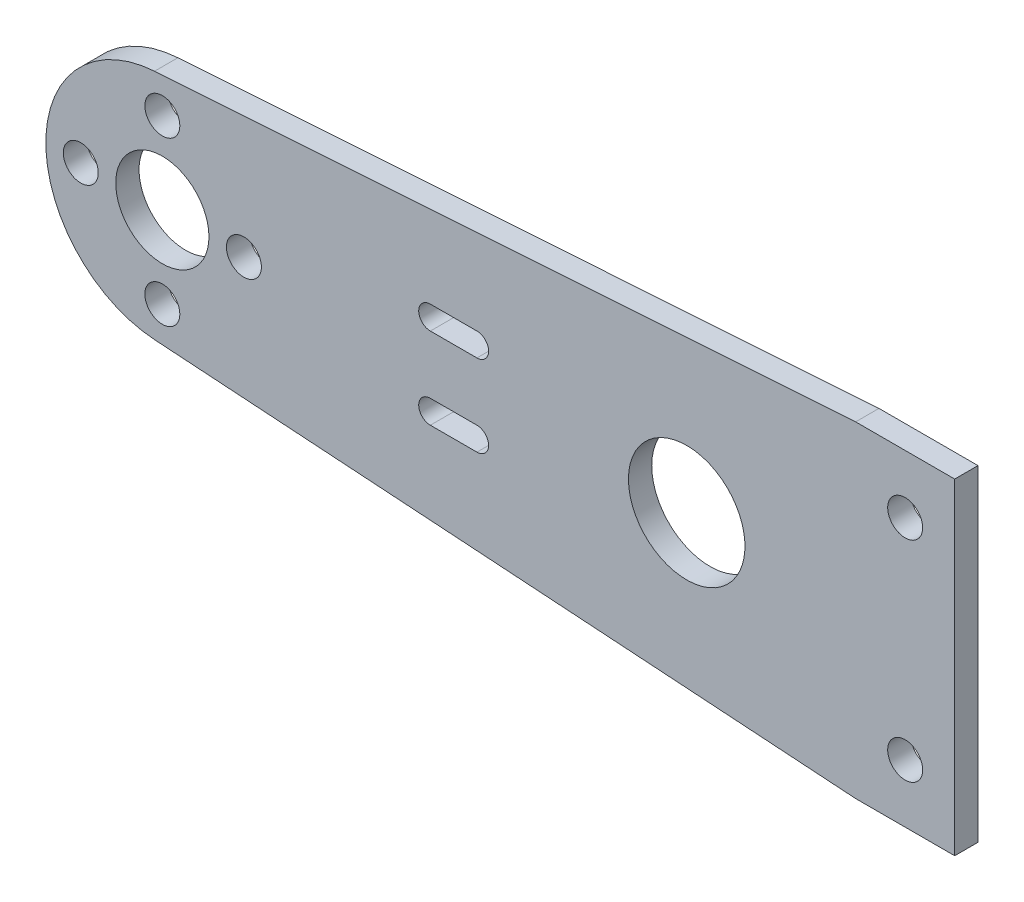
ISO-10303-21;
HEADER;
FILE_DESCRIPTION(('STEP AP214'),'2;1');
FILE_NAME('part.step','',(''),(''),'','','');
FILE_SCHEMA(('AUTOMOTIVE_DESIGN { 1 0 10303 214 1 1 1 1 }'));
ENDSEC;
DATA;
#1=APPLICATION_CONTEXT('core data for automotive mechanical design processes');
#2=APPLICATION_PROTOCOL_DEFINITION('international standard','automotive_design',2000,#1);
#3=PRODUCT_CONTEXT('',#1,'mechanical');
#4=PRODUCT('Part','Part','',(#3));
#5=PRODUCT_RELATED_PRODUCT_CATEGORY('part','',(#4));
#6=PRODUCT_DEFINITION_FORMATION('','',#4);
#7=PRODUCT_DEFINITION_CONTEXT('part definition',#1,'design');
#8=PRODUCT_DEFINITION('design','',#6,#7);
#9=PRODUCT_DEFINITION_SHAPE('','',#8);
#10=(LENGTH_UNIT() NAMED_UNIT(*) SI_UNIT(.MILLI.,.METRE.));
#11=(NAMED_UNIT(*) PLANE_ANGLE_UNIT() SI_UNIT($,.RADIAN.));
#12=(NAMED_UNIT(*) SI_UNIT($,.STERADIAN.) SOLID_ANGLE_UNIT());
#13=UNCERTAINTY_MEASURE_WITH_UNIT(LENGTH_MEASURE(1.E-05),#10,'distance_accuracy_value','');
#14=(GEOMETRIC_REPRESENTATION_CONTEXT(3) GLOBAL_UNCERTAINTY_ASSIGNED_CONTEXT((#13)) GLOBAL_UNIT_ASSIGNED_CONTEXT((#10,
#11,#12)) REPRESENTATION_CONTEXT('',''));
#15=CARTESIAN_POINT('',(0.,0.,0.));
#16=DIRECTION('',(0.,0.,1.));
#17=DIRECTION('',(1.,0.,0.));
#18=AXIS2_PLACEMENT_3D('',#15,#16,#17);
#19=CARTESIAN_POINT('',(0.,0.,2.));
#20=DIRECTION('',(0.,0.,1.));
#21=DIRECTION('',(1.,0.,0.));
#22=AXIS2_PLACEMENT_3D('',#19,#20,#21);
#23=PLANE('',#22);
#24=CARTESIAN_POINT('',(27.,3.5,2.));
#25=DIRECTION('',(0.,0.,-1.));
#26=DIRECTION('',(1.,0.,0.));
#27=AXIS2_PLACEMENT_3D('',#24,#25,#26);
#28=CIRCLE('',#27,0.999999999999994);
#29=CARTESIAN_POINT('',(27.,4.49999999999999,2.));
#30=VERTEX_POINT('',#29);
#31=CARTESIAN_POINT('',(27.,2.50000000000001,2.));
#32=VERTEX_POINT('',#31);
#33=EDGE_CURVE('E141',#30,#32,#28,.T.);
#34=ORIENTED_EDGE('',*,*,#33,.T.);
#35=DIRECTION('',(-1.,0.,0.));
#36=VECTOR('',#35,1.);
#37=CARTESIAN_POINT('',(27.,2.50000000000001,2.));
#38=LINE('',#37,#36);
#39=CARTESIAN_POINT('',(23.,2.50000000000001,2.));
#40=VERTEX_POINT('',#39);
#41=EDGE_CURVE('E152',#32,#40,#38,.T.);
#42=ORIENTED_EDGE('',*,*,#41,.T.);
#43=CARTESIAN_POINT('',(23.,3.5,2.));
#44=DIRECTION('',(0.,0.,-1.));
#45=DIRECTION('',(1.,0.,0.));
#46=AXIS2_PLACEMENT_3D('',#43,#44,#45);
#47=CIRCLE('',#46,0.999999999999994);
#48=CARTESIAN_POINT('',(23.,4.49999999999999,2.));
#49=VERTEX_POINT('',#48);
#50=EDGE_CURVE('E51',#40,#49,#47,.T.);
#51=ORIENTED_EDGE('',*,*,#50,.T.);
#52=DIRECTION('',(1.,0.,0.));
#53=VECTOR('',#52,1.);
#54=CARTESIAN_POINT('',(27.,4.49999999999999,2.));
#55=LINE('',#54,#53);
#56=EDGE_CURVE('E149',#49,#30,#55,.T.);
#57=ORIENTED_EDGE('',*,*,#56,.T.);
#58=EDGE_LOOP('',(#34,#42,#51,#57));
#59=FACE_BOUND('',#58,.T.);
#60=CARTESIAN_POINT('',(45.,0.,2.));
#61=DIRECTION('',(0.,0.,-1.));
#62=DIRECTION('',(-1.,0.,0.));
#63=AXIS2_PLACEMENT_3D('',#60,#61,#62);
#64=CIRCLE('',#63,5.);
#65=CARTESIAN_POINT('',(40.,0.,2.));
#66=VERTEX_POINT('',#65);
#67=EDGE_CURVE('E194',#66,#66,#64,.T.);
#68=ORIENTED_EDGE('',*,*,#67,.T.);
#69=EDGE_LOOP('',(#68));
#70=FACE_BOUND('',#69,.T.);
#71=CARTESIAN_POINT('',(27.,-3.5,2.));
#72=DIRECTION('',(0.,0.,-1.));
#73=DIRECTION('',(-1.,0.,0.));
#74=AXIS2_PLACEMENT_3D('',#71,#72,#73);
#75=CIRCLE('',#74,0.999999999999994);
#76=CARTESIAN_POINT('',(27.,-2.50000000000001,2.));
#77=VERTEX_POINT('',#76);
#78=CARTESIAN_POINT('',(27.,-4.5,2.));
#79=VERTEX_POINT('',#78);
#80=EDGE_CURVE('E179',#77,#79,#75,.T.);
#81=ORIENTED_EDGE('',*,*,#80,.T.);
#82=DIRECTION('',(-1.,0.,0.));
#83=VECTOR('',#82,1.);
#84=CARTESIAN_POINT('',(27.,-4.5,2.));
#85=LINE('',#84,#83);
#86=CARTESIAN_POINT('',(23.,-4.5,2.));
#87=VERTEX_POINT('',#86);
#88=EDGE_CURVE('E182',#79,#87,#85,.T.);
#89=ORIENTED_EDGE('',*,*,#88,.T.);
#90=CARTESIAN_POINT('',(23.,-3.5,2.));
#91=DIRECTION('',(0.,0.,-1.));
#92=DIRECTION('',(-1.,0.,0.));
#93=AXIS2_PLACEMENT_3D('',#90,#91,#92);
#94=CIRCLE('',#93,0.999999999999993);
#95=CARTESIAN_POINT('',(23.,-2.50000000000001,2.));
#96=VERTEX_POINT('',#95);
#97=EDGE_CURVE('E59',#87,#96,#94,.T.);
#98=ORIENTED_EDGE('',*,*,#97,.T.);
#99=DIRECTION('',(1.,0.,0.));
#100=VECTOR('',#99,1.);
#101=CARTESIAN_POINT('',(27.,-2.50000000000001,2.));
#102=LINE('',#101,#100);
#103=EDGE_CURVE('E187',#96,#77,#102,.T.);
#104=ORIENTED_EDGE('',*,*,#103,.T.);
#105=EDGE_LOOP('',(#81,#89,#98,#104));
#106=FACE_BOUND('',#105,.T.);
#107=CARTESIAN_POINT('',(0.,7.,2.));
#108=DIRECTION('',(0.,0.,1.));
#109=DIRECTION('',(1.,0.,0.));
#110=AXIS2_PLACEMENT_3D('',#107,#108,#109);
#111=CIRCLE('',#110,1.50000000000001);
#112=CARTESIAN_POINT('',(1.50000000000001,7.,2.));
#113=VERTEX_POINT('',#112);
#114=EDGE_CURVE('E217',#113,#113,#111,.T.);
#115=ORIENTED_EDGE('',*,*,#114,.F.);
#116=EDGE_LOOP('',(#115));
#117=FACE_BOUND('',#116,.T.);
#118=CARTESIAN_POINT('',(0.,-7.,2.));
#119=DIRECTION('',(0.,0.,1.));
#120=DIRECTION('',(1.,0.,0.));
#121=AXIS2_PLACEMENT_3D('',#118,#119,#120);
#122=CIRCLE('',#121,1.5);
#123=CARTESIAN_POINT('',(1.5,-7.,2.));
#124=VERTEX_POINT('',#123);
#125=EDGE_CURVE('E229',#124,#124,#122,.T.);
#126=ORIENTED_EDGE('',*,*,#125,.F.);
#127=EDGE_LOOP('',(#126));
#128=FACE_BOUND('',#127,.T.);
#129=CARTESIAN_POINT('',(0.,0.,2.));
#130=DIRECTION('',(0.,0.,1.));
#131=DIRECTION('',(1.,0.,0.));
#132=AXIS2_PLACEMENT_3D('',#129,#130,#131);
#133=CIRCLE('',#132,4.00000000000001);
#134=CARTESIAN_POINT('',(4.00000000000001,0.,2.));
#135=VERTEX_POINT('',#134);
#136=EDGE_CURVE('E241',#135,#135,#133,.T.);
#137=ORIENTED_EDGE('',*,*,#136,.F.);
#138=EDGE_LOOP('',(#137));
#139=FACE_BOUND('',#138,.T.);
#140=CARTESIAN_POINT('',(0.,0.,2.));
#141=DIRECTION('',(0.,0.,1.));
#142=DIRECTION('',(1.,0.,0.));
#143=AXIS2_PLACEMENT_3D('',#140,#141,#142);
#144=CIRCLE('',#143,10.);
#145=CARTESIAN_POINT('',(-0.667028634575726,9.977728839804,2.));
#146=VERTEX_POINT('',#145);
#147=CARTESIAN_POINT('',(-0.667028634575722,-9.97772883980402,2.));
#148=VERTEX_POINT('',#147);
#149=EDGE_CURVE('E253',#146,#148,#144,.T.);
#150=ORIENTED_EDGE('',*,*,#149,.T.);
#151=DIRECTION('',(0.997772883980398,-0.0667028634575719,0.));
#152=VECTOR('',#151,1.);
#153=CARTESIAN_POINT('',(-0.667028634575722,-9.97772883980402,2.));
#154=LINE('',#153,#152);
#155=CARTESIAN_POINT('',(59.5,-14.,2.));
#156=VERTEX_POINT('',#155);
#157=EDGE_CURVE('E256',#148,#156,#154,.T.);
#158=ORIENTED_EDGE('',*,*,#157,.T.);
#159=DIRECTION('',(1.,0.,0.));
#160=VECTOR('',#159,1.);
#161=CARTESIAN_POINT('',(59.5,-14.,2.));
#162=LINE('',#161,#160);
#163=CARTESIAN_POINT('',(68.,-14.,2.));
#164=VERTEX_POINT('',#163);
#165=EDGE_CURVE('E259',#156,#164,#162,.T.);
#166=ORIENTED_EDGE('',*,*,#165,.T.);
#167=DIRECTION('',(0.,1.,0.));
#168=VECTOR('',#167,1.);
#169=CARTESIAN_POINT('',(68.,-14.,2.));
#170=LINE('',#169,#168);
#171=CARTESIAN_POINT('',(68.,14.,2.));
#172=VERTEX_POINT('',#171);
#173=EDGE_CURVE('E261',#164,#172,#170,.T.);
#174=ORIENTED_EDGE('',*,*,#173,.T.);
#175=DIRECTION('',(-1.,0.,0.));
#176=VECTOR('',#175,1.);
#177=CARTESIAN_POINT('',(59.5,14.,2.));
#178=LINE('',#177,#176);
#179=CARTESIAN_POINT('',(59.5,14.,2.));
#180=VERTEX_POINT('',#179);
#181=EDGE_CURVE('E263',#172,#180,#178,.T.);
#182=ORIENTED_EDGE('',*,*,#181,.T.);
#183=DIRECTION('',(-0.997772883980398,-0.0667028634575723,0.));
#184=VECTOR('',#183,1.);
#185=CARTESIAN_POINT('',(-0.667028634575726,9.977728839804,2.));
#186=LINE('',#185,#184);
#187=EDGE_CURVE('E265',#180,#146,#186,.T.);
#188=ORIENTED_EDGE('',*,*,#187,.T.);
#189=EDGE_LOOP('',(#150,#158,#166,#174,#182,#188));
#190=FACE_BOUND('',#189,.T.);
#191=CARTESIAN_POINT('',(63.75,9.,2.));
#192=DIRECTION('',(0.,0.,1.));
#193=DIRECTION('',(1.,0.,0.));
#194=AXIS2_PLACEMENT_3D('',#191,#192,#193);
#195=CIRCLE('',#194,1.49999999999997);
#196=CARTESIAN_POINT('',(65.25,9.,2.));
#197=VERTEX_POINT('',#196);
#198=EDGE_CURVE('E247',#197,#197,#195,.T.);
#199=ORIENTED_EDGE('',*,*,#198,.F.);
#200=EDGE_LOOP('',(#199));
#201=FACE_BOUND('',#200,.T.);
#202=CARTESIAN_POINT('',(7.,0.,2.));
#203=DIRECTION('',(0.,0.,1.));
#204=DIRECTION('',(1.,0.,0.));
#205=AXIS2_PLACEMENT_3D('',#202,#203,#204);
#206=CIRCLE('',#205,1.5);
#207=CARTESIAN_POINT('',(8.5,0.,2.));
#208=VERTEX_POINT('',#207);
#209=EDGE_CURVE('E235',#208,#208,#206,.T.);
#210=ORIENTED_EDGE('',*,*,#209,.F.);
#211=EDGE_LOOP('',(#210));
#212=FACE_BOUND('',#211,.T.);
#213=CARTESIAN_POINT('',(-7.00000000000001,0.,2.));
#214=DIRECTION('',(0.,0.,1.));
#215=DIRECTION('',(1.,0.,0.));
#216=AXIS2_PLACEMENT_3D('',#213,#214,#215);
#217=CIRCLE('',#216,1.5);
#218=CARTESIAN_POINT('',(-5.50000000000001,0.,2.));
#219=VERTEX_POINT('',#218);
#220=EDGE_CURVE('E223',#219,#219,#217,.T.);
#221=ORIENTED_EDGE('',*,*,#220,.F.);
#222=EDGE_LOOP('',(#221));
#223=FACE_BOUND('',#222,.T.);
#224=CARTESIAN_POINT('',(63.75,-9.,2.));
#225=DIRECTION('',(0.,0.,1.));
#226=DIRECTION('',(1.,0.,0.));
#227=AXIS2_PLACEMENT_3D('',#224,#225,#226);
#228=CIRCLE('',#227,1.49999999999997);
#229=CARTESIAN_POINT('',(65.25,-9.,2.));
#230=VERTEX_POINT('',#229);
#231=EDGE_CURVE('E211',#230,#230,#228,.T.);
#232=ORIENTED_EDGE('',*,*,#231,.F.);
#233=EDGE_LOOP('',(#232));
#234=FACE_BOUND('',#233,.T.);
#235=ADVANCED_FACE('F36',(#59,#70,#106,#117,#128,#139,#190,#201,#212,#223,#234),#23,.T.);
#236=CARTESIAN_POINT('',(0.,0.,0.));
#237=DIRECTION('',(0.,0.,1.));
#238=DIRECTION('',(1.,0.,0.));
#239=AXIS2_PLACEMENT_3D('',#236,#237,#238);
#240=PLANE('',#239);
#241=DIRECTION('',(-1.,0.,0.));
#242=VECTOR('',#241,1.);
#243=CARTESIAN_POINT('',(27.,2.50000000000001,0.));
#244=LINE('',#243,#242);
#245=CARTESIAN_POINT('',(27.,2.50000000000001,0.));
#246=VERTEX_POINT('',#245);
#247=CARTESIAN_POINT('',(23.,2.50000000000001,0.));
#248=VERTEX_POINT('',#247);
#249=EDGE_CURVE('E170',#246,#248,#244,.T.);
#250=ORIENTED_EDGE('',*,*,#249,.F.);
#251=CARTESIAN_POINT('',(27.,3.5,0.));
#252=DIRECTION('',(0.,0.,-1.));
#253=DIRECTION('',(1.,0.,0.));
#254=AXIS2_PLACEMENT_3D('',#251,#252,#253);
#255=CIRCLE('',#254,0.999999999999994);
#256=CARTESIAN_POINT('',(27.,4.49999999999999,0.));
#257=VERTEX_POINT('',#256);
#258=EDGE_CURVE('E144',#257,#246,#255,.T.);
#259=ORIENTED_EDGE('',*,*,#258,.F.);
#260=DIRECTION('',(1.,0.,0.));
#261=VECTOR('',#260,1.);
#262=CARTESIAN_POINT('',(27.,4.49999999999999,0.));
#263=LINE('',#262,#261);
#264=CARTESIAN_POINT('',(23.,4.49999999999999,0.));
#265=VERTEX_POINT('',#264);
#266=EDGE_CURVE('E158',#265,#257,#263,.T.);
#267=ORIENTED_EDGE('',*,*,#266,.F.);
#268=CARTESIAN_POINT('',(23.,3.5,0.));
#269=DIRECTION('',(0.,0.,-1.));
#270=DIRECTION('',(1.,0.,0.));
#271=AXIS2_PLACEMENT_3D('',#268,#269,#270);
#272=CIRCLE('',#271,0.999999999999994);
#273=EDGE_CURVE('E161',#248,#265,#272,.T.);
#274=ORIENTED_EDGE('',*,*,#273,.F.);
#275=EDGE_LOOP('',(#250,#259,#267,#274));
#276=FACE_BOUND('',#275,.T.);
#277=CARTESIAN_POINT('',(45.,0.,0.));
#278=DIRECTION('',(0.,0.,-1.));
#279=DIRECTION('',(-1.,0.,0.));
#280=AXIS2_PLACEMENT_3D('',#277,#278,#279);
#281=CIRCLE('',#280,5.);
#282=CARTESIAN_POINT('',(40.,0.,0.));
#283=VERTEX_POINT('',#282);
#284=EDGE_CURVE('E164',#283,#283,#281,.T.);
#285=ORIENTED_EDGE('',*,*,#284,.F.);
#286=EDGE_LOOP('',(#285));
#287=FACE_BOUND('',#286,.T.);
#288=DIRECTION('',(-1.,0.,0.));
#289=VECTOR('',#288,1.);
#290=CARTESIAN_POINT('',(27.,-4.5,0.));
#291=LINE('',#290,#289);
#292=CARTESIAN_POINT('',(27.,-4.5,0.));
#293=VERTEX_POINT('',#292);
#294=CARTESIAN_POINT('',(23.,-4.49999999999999,0.));
#295=VERTEX_POINT('',#294);
#296=EDGE_CURVE('E193',#293,#295,#291,.T.);
#297=ORIENTED_EDGE('',*,*,#296,.F.);
#298=CARTESIAN_POINT('',(27.,-3.5,0.));
#299=DIRECTION('',(0.,0.,-1.));
#300=DIRECTION('',(-1.,0.,0.));
#301=AXIS2_PLACEMENT_3D('',#298,#299,#300);
#302=CIRCLE('',#301,0.999999999999994);
#303=CARTESIAN_POINT('',(27.,-2.50000000000001,0.));
#304=VERTEX_POINT('',#303);
#305=EDGE_CURVE('E191',#304,#293,#302,.T.);
#306=ORIENTED_EDGE('',*,*,#305,.F.);
#307=DIRECTION('',(1.,0.,0.));
#308=VECTOR('',#307,1.);
#309=CARTESIAN_POINT('',(27.,-2.50000000000001,0.));
#310=LINE('',#309,#308);
#311=CARTESIAN_POINT('',(23.,-2.50000000000001,0.));
#312=VERTEX_POINT('',#311);
#313=EDGE_CURVE('E183',#312,#304,#310,.T.);
#314=ORIENTED_EDGE('',*,*,#313,.F.);
#315=CARTESIAN_POINT('',(23.,-3.5,0.));
#316=DIRECTION('',(0.,0.,-1.));
#317=DIRECTION('',(-1.,0.,0.));
#318=AXIS2_PLACEMENT_3D('',#315,#316,#317);
#319=CIRCLE('',#318,0.999999999999993);
#320=EDGE_CURVE('E197',#295,#312,#319,.T.);
#321=ORIENTED_EDGE('',*,*,#320,.F.);
#322=EDGE_LOOP('',(#297,#306,#314,#321));
#323=FACE_BOUND('',#322,.T.);
#324=CARTESIAN_POINT('',(0.,0.,0.));
#325=DIRECTION('',(0.,0.,1.));
#326=DIRECTION('',(1.,0.,0.));
#327=AXIS2_PLACEMENT_3D('',#324,#325,#326);
#328=CIRCLE('',#327,10.);
#329=CARTESIAN_POINT('',(-0.667028634575726,9.977728839804,0.));
#330=VERTEX_POINT('',#329);
#331=CARTESIAN_POINT('',(-0.667028634575722,-9.97772883980402,0.));
#332=VERTEX_POINT('',#331);
#333=EDGE_CURVE('E250',#330,#332,#328,.T.);
#334=ORIENTED_EDGE('',*,*,#333,.F.);
#335=DIRECTION('',(-0.997772883980398,-0.0667028634575723,0.));
#336=VECTOR('',#335,1.);
#337=CARTESIAN_POINT('',(-0.667028634575726,9.977728839804,0.));
#338=LINE('',#337,#336);
#339=CARTESIAN_POINT('',(59.5,14.,0.));
#340=VERTEX_POINT('',#339);
#341=EDGE_CURVE('E257',#340,#330,#338,.T.);
#342=ORIENTED_EDGE('',*,*,#341,.F.);
#343=DIRECTION('',(-1.,0.,0.));
#344=VECTOR('',#343,1.);
#345=CARTESIAN_POINT('',(59.5,14.,0.));
#346=LINE('',#345,#344);
#347=CARTESIAN_POINT('',(68.,14.,0.));
#348=VERTEX_POINT('',#347);
#349=EDGE_CURVE('E276',#348,#340,#346,.T.);
#350=ORIENTED_EDGE('',*,*,#349,.F.);
#351=DIRECTION('',(0.,1.,0.));
#352=VECTOR('',#351,1.);
#353=CARTESIAN_POINT('',(68.,-14.,0.));
#354=LINE('',#353,#352);
#355=CARTESIAN_POINT('',(68.,-14.,0.));
#356=VERTEX_POINT('',#355);
#357=EDGE_CURVE('E274',#356,#348,#354,.T.);
#358=ORIENTED_EDGE('',*,*,#357,.F.);
#359=DIRECTION('',(1.,0.,0.));
#360=VECTOR('',#359,1.);
#361=CARTESIAN_POINT('',(59.5,-14.,0.));
#362=LINE('',#361,#360);
#363=CARTESIAN_POINT('',(59.5,-14.,0.));
#364=VERTEX_POINT('',#363);
#365=EDGE_CURVE('E272',#364,#356,#362,.T.);
#366=ORIENTED_EDGE('',*,*,#365,.F.);
#367=DIRECTION('',(0.997772883980398,-0.0667028634575719,0.));
#368=VECTOR('',#367,1.);
#369=CARTESIAN_POINT('',(-0.667028634575722,-9.97772883980402,0.));
#370=LINE('',#369,#368);
#371=EDGE_CURVE('E270',#332,#364,#370,.T.);
#372=ORIENTED_EDGE('',*,*,#371,.F.);
#373=EDGE_LOOP('',(#334,#342,#350,#358,#366,#372));
#374=FACE_BOUND('',#373,.T.);
#375=CARTESIAN_POINT('',(63.75,9.,0.));
#376=DIRECTION('',(0.,0.,1.));
#377=DIRECTION('',(1.,0.,0.));
#378=AXIS2_PLACEMENT_3D('',#375,#376,#377);
#379=CIRCLE('',#378,1.49999999999997);
#380=CARTESIAN_POINT('',(65.25,9.,0.));
#381=VERTEX_POINT('',#380);
#382=EDGE_CURVE('E244',#381,#381,#379,.T.);
#383=ORIENTED_EDGE('',*,*,#382,.T.);
#384=EDGE_LOOP('',(#383));
#385=FACE_BOUND('',#384,.T.);
#386=CARTESIAN_POINT('',(0.,0.,0.));
#387=DIRECTION('',(0.,0.,1.));
#388=DIRECTION('',(1.,0.,0.));
#389=AXIS2_PLACEMENT_3D('',#386,#387,#388);
#390=CIRCLE('',#389,4.00000000000001);
#391=CARTESIAN_POINT('',(4.00000000000001,0.,0.));
#392=VERTEX_POINT('',#391);
#393=EDGE_CURVE('E238',#392,#392,#390,.T.);
#394=ORIENTED_EDGE('',*,*,#393,.T.);
#395=EDGE_LOOP('',(#394));
#396=FACE_BOUND('',#395,.T.);
#397=CARTESIAN_POINT('',(7.,0.,0.));
#398=DIRECTION('',(0.,0.,1.));
#399=DIRECTION('',(1.,0.,0.));
#400=AXIS2_PLACEMENT_3D('',#397,#398,#399);
#401=CIRCLE('',#400,1.5);
#402=CARTESIAN_POINT('',(8.5,0.,0.));
#403=VERTEX_POINT('',#402);
#404=EDGE_CURVE('E232',#403,#403,#401,.T.);
#405=ORIENTED_EDGE('',*,*,#404,.T.);
#406=EDGE_LOOP('',(#405));
#407=FACE_BOUND('',#406,.T.);
#408=CARTESIAN_POINT('',(0.,-7.,0.));
#409=DIRECTION('',(0.,0.,1.));
#410=DIRECTION('',(1.,0.,0.));
#411=AXIS2_PLACEMENT_3D('',#408,#409,#410);
#412=CIRCLE('',#411,1.5);
#413=CARTESIAN_POINT('',(1.5,-7.,0.));
#414=VERTEX_POINT('',#413);
#415=EDGE_CURVE('E226',#414,#414,#412,.T.);
#416=ORIENTED_EDGE('',*,*,#415,.T.);
#417=EDGE_LOOP('',(#416));
#418=FACE_BOUND('',#417,.T.);
#419=CARTESIAN_POINT('',(-7.00000000000001,0.,0.));
#420=DIRECTION('',(0.,0.,1.));
#421=DIRECTION('',(1.,0.,0.));
#422=AXIS2_PLACEMENT_3D('',#419,#420,#421);
#423=CIRCLE('',#422,1.5);
#424=CARTESIAN_POINT('',(-5.50000000000001,0.,0.));
#425=VERTEX_POINT('',#424);
#426=EDGE_CURVE('E220',#425,#425,#423,.T.);
#427=ORIENTED_EDGE('',*,*,#426,.T.);
#428=EDGE_LOOP('',(#427));
#429=FACE_BOUND('',#428,.T.);
#430=CARTESIAN_POINT('',(0.,7.,0.));
#431=DIRECTION('',(0.,0.,1.));
#432=DIRECTION('',(1.,0.,0.));
#433=AXIS2_PLACEMENT_3D('',#430,#431,#432);
#434=CIRCLE('',#433,1.50000000000001);
#435=CARTESIAN_POINT('',(1.50000000000001,7.,0.));
#436=VERTEX_POINT('',#435);
#437=EDGE_CURVE('E214',#436,#436,#434,.T.);
#438=ORIENTED_EDGE('',*,*,#437,.T.);
#439=EDGE_LOOP('',(#438));
#440=FACE_BOUND('',#439,.T.);
#441=CARTESIAN_POINT('',(63.75,-9.,0.));
#442=DIRECTION('',(0.,0.,1.));
#443=DIRECTION('',(1.,0.,0.));
#444=AXIS2_PLACEMENT_3D('',#441,#442,#443);
#445=CIRCLE('',#444,1.49999999999997);
#446=CARTESIAN_POINT('',(65.25,-9.,0.));
#447=VERTEX_POINT('',#446);
#448=EDGE_CURVE('E204',#447,#447,#445,.T.);
#449=ORIENTED_EDGE('',*,*,#448,.T.);
#450=EDGE_LOOP('',(#449));
#451=FACE_BOUND('',#450,.T.);
#452=ADVANCED_FACE('F300',(#276,#287,#323,#374,#385,#396,#407,#418,#429,#440,#451),#240,.F.);
#453=CARTESIAN_POINT('',(0.,0.,2.));
#454=DIRECTION('',(0.,0.,-1.));
#455=DIRECTION('',(-1.,0.,0.));
#456=AXIS2_PLACEMENT_3D('',#453,#454,#455);
#457=CYLINDRICAL_SURFACE('',#456,10.);
#458=ORIENTED_EDGE('',*,*,#333,.T.);
#459=DIRECTION('',(0.,0.,-1.));
#460=VECTOR('',#459,1.);
#461=CARTESIAN_POINT('',(-0.667028634575722,-9.97772883980402,2.));
#462=LINE('',#461,#460);
#463=EDGE_CURVE('E11',#148,#332,#462,.T.);
#464=ORIENTED_EDGE('',*,*,#463,.F.);
#465=ORIENTED_EDGE('',*,*,#149,.F.);
#466=DIRECTION('',(0.,0.,-1.));
#467=VECTOR('',#466,1.);
#468=CARTESIAN_POINT('',(-0.667028634575726,9.977728839804,2.));
#469=LINE('',#468,#467);
#470=EDGE_CURVE('E267',#146,#330,#469,.T.);
#471=ORIENTED_EDGE('',*,*,#470,.T.);
#472=EDGE_LOOP('',(#458,#464,#465,#471));
#473=FACE_BOUND('',#472,.T.);
#474=ADVANCED_FACE('F38',(#473),#457,.T.);
#475=CARTESIAN_POINT('',(-0.667028634575722,-9.97772883980402,2.));
#476=DIRECTION('',(0.0667028634575719,0.997772883980398,0.));
#477=DIRECTION('',(-0.997772883980398,0.0667028634575719,0.));
#478=AXIS2_PLACEMENT_3D('',#475,#476,#477);
#479=PLANE('',#478);
#480=ORIENTED_EDGE('',*,*,#371,.T.);
#481=DIRECTION('',(0.,0.,-1.));
#482=VECTOR('',#481,1.);
#483=CARTESIAN_POINT('',(59.5,-14.,2.));
#484=LINE('',#483,#482);
#485=EDGE_CURVE('E44',#156,#364,#484,.T.);
#486=ORIENTED_EDGE('',*,*,#485,.F.);
#487=ORIENTED_EDGE('',*,*,#157,.F.);
#488=ORIENTED_EDGE('',*,*,#463,.T.);
#489=EDGE_LOOP('',(#480,#486,#487,#488));
#490=FACE_BOUND('',#489,.T.);
#491=ADVANCED_FACE('F318',(#490),#479,.F.);
#492=CARTESIAN_POINT('',(59.5,-14.,2.));
#493=DIRECTION('',(0.,1.,0.));
#494=DIRECTION('',(0.,0.,1.));
#495=AXIS2_PLACEMENT_3D('',#492,#493,#494);
#496=PLANE('',#495);
#497=ORIENTED_EDGE('',*,*,#365,.T.);
#498=DIRECTION('',(0.,0.,-1.));
#499=VECTOR('',#498,1.);
#500=CARTESIAN_POINT('',(68.,-14.,2.));
#501=LINE('',#500,#499);
#502=EDGE_CURVE('E287',#164,#356,#501,.T.);
#503=ORIENTED_EDGE('',*,*,#502,.F.);
#504=ORIENTED_EDGE('',*,*,#165,.F.);
#505=ORIENTED_EDGE('',*,*,#485,.T.);
#506=EDGE_LOOP('',(#497,#503,#504,#505));
#507=FACE_BOUND('',#506,.T.);
#508=ADVANCED_FACE('F294',(#507),#496,.F.);
#509=CARTESIAN_POINT('',(68.,-14.,2.));
#510=DIRECTION('',(-1.,0.,0.));
#511=DIRECTION('',(0.,0.,1.));
#512=AXIS2_PLACEMENT_3D('',#509,#510,#511);
#513=PLANE('',#512);
#514=ORIENTED_EDGE('',*,*,#357,.T.);
#515=DIRECTION('',(0.,0.,-1.));
#516=VECTOR('',#515,1.);
#517=CARTESIAN_POINT('',(68.,14.,2.));
#518=LINE('',#517,#516);
#519=EDGE_CURVE('E284',#172,#348,#518,.T.);
#520=ORIENTED_EDGE('',*,*,#519,.F.);
#521=ORIENTED_EDGE('',*,*,#173,.F.);
#522=ORIENTED_EDGE('',*,*,#502,.T.);
#523=EDGE_LOOP('',(#514,#520,#521,#522));
#524=FACE_BOUND('',#523,.T.);
#525=ADVANCED_FACE('F306',(#524),#513,.F.);
#526=CARTESIAN_POINT('',(59.5,14.,2.));
#527=DIRECTION('',(0.,-1.,0.));
#528=DIRECTION('',(1.,0.,0.));
#529=AXIS2_PLACEMENT_3D('',#526,#527,#528);
#530=PLANE('',#529);
#531=ORIENTED_EDGE('',*,*,#349,.T.);
#532=DIRECTION('',(0.,0.,-1.));
#533=VECTOR('',#532,1.);
#534=CARTESIAN_POINT('',(59.5,14.,2.));
#535=LINE('',#534,#533);
#536=EDGE_CURVE('E281',#180,#340,#535,.T.);
#537=ORIENTED_EDGE('',*,*,#536,.F.);
#538=ORIENTED_EDGE('',*,*,#181,.F.);
#539=ORIENTED_EDGE('',*,*,#519,.T.);
#540=EDGE_LOOP('',(#531,#537,#538,#539));
#541=FACE_BOUND('',#540,.T.);
#542=ADVANCED_FACE('F310',(#541),#530,.F.);
#543=CARTESIAN_POINT('',(-0.667028634575726,9.977728839804,2.));
#544=DIRECTION('',(0.0667028634575723,-0.997772883980398,0.));
#545=DIRECTION('',(0.997772883980398,0.0667028634575723,0.));
#546=AXIS2_PLACEMENT_3D('',#543,#544,#545);
#547=PLANE('',#546);
#548=ORIENTED_EDGE('',*,*,#341,.T.);
#549=ORIENTED_EDGE('',*,*,#470,.F.);
#550=ORIENTED_EDGE('',*,*,#187,.F.);
#551=ORIENTED_EDGE('',*,*,#536,.T.);
#552=EDGE_LOOP('',(#548,#549,#550,#551));
#553=FACE_BOUND('',#552,.T.);
#554=ADVANCED_FACE('F321',(#553),#547,.F.);
#555=CARTESIAN_POINT('',(63.75,9.,2.));
#556=DIRECTION('',(0.,0.,-1.));
#557=DIRECTION('',(-1.,0.,0.));
#558=AXIS2_PLACEMENT_3D('',#555,#556,#557);
#559=CYLINDRICAL_SURFACE('',#558,1.49999999999997);
#560=ORIENTED_EDGE('',*,*,#198,.T.);
#561=EDGE_LOOP('',(#560));
#562=FACE_BOUND('',#561,.T.);
#563=ORIENTED_EDGE('',*,*,#382,.F.);
#564=EDGE_LOOP('',(#563));
#565=FACE_BOUND('',#564,.T.);
#566=ADVANCED_FACE('F323',(#562,#565),#559,.F.);
#567=CARTESIAN_POINT('',(0.,0.,2.));
#568=DIRECTION('',(0.,0.,-1.));
#569=DIRECTION('',(-1.,0.,0.));
#570=AXIS2_PLACEMENT_3D('',#567,#568,#569);
#571=CYLINDRICAL_SURFACE('',#570,4.00000000000001);
#572=ORIENTED_EDGE('',*,*,#136,.T.);
#573=EDGE_LOOP('',(#572));
#574=FACE_BOUND('',#573,.T.);
#575=ORIENTED_EDGE('',*,*,#393,.F.);
#576=EDGE_LOOP('',(#575));
#577=FACE_BOUND('',#576,.T.);
#578=ADVANCED_FACE('F329',(#574,#577),#571,.F.);
#579=CARTESIAN_POINT('',(7.,0.,2.));
#580=DIRECTION('',(0.,0.,-1.));
#581=DIRECTION('',(-1.,0.,0.));
#582=AXIS2_PLACEMENT_3D('',#579,#580,#581);
#583=CYLINDRICAL_SURFACE('',#582,1.5);
#584=ORIENTED_EDGE('',*,*,#209,.T.);
#585=EDGE_LOOP('',(#584));
#586=FACE_BOUND('',#585,.T.);
#587=ORIENTED_EDGE('',*,*,#404,.F.);
#588=EDGE_LOOP('',(#587));
#589=FACE_BOUND('',#588,.T.);
#590=ADVANCED_FACE('F343',(#586,#589),#583,.F.);
#591=CARTESIAN_POINT('',(0.,-7.,2.));
#592=DIRECTION('',(0.,0.,-1.));
#593=DIRECTION('',(-1.,0.,0.));
#594=AXIS2_PLACEMENT_3D('',#591,#592,#593);
#595=CYLINDRICAL_SURFACE('',#594,1.5);
#596=ORIENTED_EDGE('',*,*,#125,.T.);
#597=EDGE_LOOP('',(#596));
#598=FACE_BOUND('',#597,.T.);
#599=ORIENTED_EDGE('',*,*,#415,.F.);
#600=EDGE_LOOP('',(#599));
#601=FACE_BOUND('',#600,.T.);
#602=ADVANCED_FACE('F347',(#598,#601),#595,.F.);
#603=CARTESIAN_POINT('',(-7.00000000000001,0.,2.));
#604=DIRECTION('',(0.,0.,-1.));
#605=DIRECTION('',(-1.,0.,0.));
#606=AXIS2_PLACEMENT_3D('',#603,#604,#605);
#607=CYLINDRICAL_SURFACE('',#606,1.5);
#608=ORIENTED_EDGE('',*,*,#220,.T.);
#609=EDGE_LOOP('',(#608));
#610=FACE_BOUND('',#609,.T.);
#611=ORIENTED_EDGE('',*,*,#426,.F.);
#612=EDGE_LOOP('',(#611));
#613=FACE_BOUND('',#612,.T.);
#614=ADVANCED_FACE('F351',(#610,#613),#607,.F.);
#615=CARTESIAN_POINT('',(0.,7.,2.));
#616=DIRECTION('',(0.,0.,-1.));
#617=DIRECTION('',(-1.,0.,0.));
#618=AXIS2_PLACEMENT_3D('',#615,#616,#617);
#619=CYLINDRICAL_SURFACE('',#618,1.50000000000001);
#620=ORIENTED_EDGE('',*,*,#114,.T.);
#621=EDGE_LOOP('',(#620));
#622=FACE_BOUND('',#621,.T.);
#623=ORIENTED_EDGE('',*,*,#437,.F.);
#624=EDGE_LOOP('',(#623));
#625=FACE_BOUND('',#624,.T.);
#626=ADVANCED_FACE('F355',(#622,#625),#619,.F.);
#627=CARTESIAN_POINT('',(63.75,-9.,2.));
#628=DIRECTION('',(0.,0.,-1.));
#629=DIRECTION('',(-1.,0.,0.));
#630=AXIS2_PLACEMENT_3D('',#627,#628,#629);
#631=CYLINDRICAL_SURFACE('',#630,1.49999999999997);
#632=ORIENTED_EDGE('',*,*,#231,.T.);
#633=EDGE_LOOP('',(#632));
#634=FACE_BOUND('',#633,.T.);
#635=ORIENTED_EDGE('',*,*,#448,.F.);
#636=EDGE_LOOP('',(#635));
#637=FACE_BOUND('',#636,.T.);
#638=ADVANCED_FACE('F359',(#634,#637),#631,.F.);
#639=CARTESIAN_POINT('',(27.,-3.5,2.));
#640=DIRECTION('',(0.,0.,-1.));
#641=DIRECTION('',(-1.,0.,0.));
#642=AXIS2_PLACEMENT_3D('',#639,#640,#641);
#643=CYLINDRICAL_SURFACE('',#642,0.999999999999994);
#644=ORIENTED_EDGE('',*,*,#305,.T.);
#645=DIRECTION('',(0.,0.,-1.));
#646=VECTOR('',#645,1.);
#647=CARTESIAN_POINT('',(27.,-4.5,2.));
#648=LINE('',#647,#646);
#649=EDGE_CURVE('E190',#79,#293,#648,.T.);
#650=ORIENTED_EDGE('',*,*,#649,.F.);
#651=ORIENTED_EDGE('',*,*,#80,.F.);
#652=DIRECTION('',(0.,0.,-1.));
#653=VECTOR('',#652,1.);
#654=CARTESIAN_POINT('',(27.,-2.50000000000001,2.));
#655=LINE('',#654,#653);
#656=EDGE_CURVE('E202',#77,#304,#655,.T.);
#657=ORIENTED_EDGE('',*,*,#656,.T.);
#658=EDGE_LOOP('',(#644,#650,#651,#657));
#659=FACE_BOUND('',#658,.T.);
#660=ADVANCED_FACE('F363',(#659),#643,.F.);
#661=CARTESIAN_POINT('',(27.,-2.50000000000001,2.));
#662=DIRECTION('',(0.,1.,0.));
#663=DIRECTION('',(-1.,0.,0.));
#664=AXIS2_PLACEMENT_3D('',#661,#662,#663);
#665=PLANE('',#664);
#666=ORIENTED_EDGE('',*,*,#313,.T.);
#667=ORIENTED_EDGE('',*,*,#656,.F.);
#668=ORIENTED_EDGE('',*,*,#103,.F.);
#669=DIRECTION('',(0.,0.,-1.));
#670=VECTOR('',#669,1.);
#671=CARTESIAN_POINT('',(23.,-2.50000000000001,2.));
#672=LINE('',#671,#670);
#673=EDGE_CURVE('E205',#96,#312,#672,.T.);
#674=ORIENTED_EDGE('',*,*,#673,.T.);
#675=EDGE_LOOP('',(#666,#667,#668,#674));
#676=FACE_BOUND('',#675,.T.);
#677=ADVANCED_FACE('F367',(#676),#665,.F.);
#678=CARTESIAN_POINT('',(23.,-3.5,2.));
#679=DIRECTION('',(0.,0.,-1.));
#680=DIRECTION('',(-1.,0.,0.));
#681=AXIS2_PLACEMENT_3D('',#678,#679,#680);
#682=CYLINDRICAL_SURFACE('',#681,0.999999999999993);
#683=ORIENTED_EDGE('',*,*,#320,.T.);
#684=ORIENTED_EDGE('',*,*,#673,.F.);
#685=ORIENTED_EDGE('',*,*,#97,.F.);
#686=DIRECTION('',(0.,0.,-1.));
#687=VECTOR('',#686,1.);
#688=CARTESIAN_POINT('',(23.,-4.49999999999999,2.));
#689=LINE('',#688,#687);
#690=EDGE_CURVE('E207',#87,#295,#689,.T.);
#691=ORIENTED_EDGE('',*,*,#690,.T.);
#692=EDGE_LOOP('',(#683,#684,#685,#691));
#693=FACE_BOUND('',#692,.T.);
#694=ADVANCED_FACE('F373',(#693),#682,.F.);
#695=CARTESIAN_POINT('',(27.,-4.5,2.));
#696=DIRECTION('',(0.,-1.,0.));
#697=DIRECTION('',(1.,0.,0.));
#698=AXIS2_PLACEMENT_3D('',#695,#696,#697);
#699=PLANE('',#698);
#700=ORIENTED_EDGE('',*,*,#296,.T.);
#701=ORIENTED_EDGE('',*,*,#690,.F.);
#702=ORIENTED_EDGE('',*,*,#88,.F.);
#703=ORIENTED_EDGE('',*,*,#649,.T.);
#704=EDGE_LOOP('',(#700,#701,#702,#703));
#705=FACE_BOUND('',#704,.T.);
#706=ADVANCED_FACE('F369',(#705),#699,.F.);
#707=CARTESIAN_POINT('',(45.,0.,2.));
#708=DIRECTION('',(0.,0.,-1.));
#709=DIRECTION('',(-1.,0.,0.));
#710=AXIS2_PLACEMENT_3D('',#707,#708,#709);
#711=CYLINDRICAL_SURFACE('',#710,5.);
#712=ORIENTED_EDGE('',*,*,#67,.F.);
#713=EDGE_LOOP('',(#712));
#714=FACE_BOUND('',#713,.T.);
#715=ORIENTED_EDGE('',*,*,#284,.T.);
#716=EDGE_LOOP('',(#715));
#717=FACE_BOUND('',#716,.T.);
#718=ADVANCED_FACE('F372',(#714,#717),#711,.F.);
#719=CARTESIAN_POINT('',(27.,3.5,2.));
#720=DIRECTION('',(0.,0.,-1.));
#721=DIRECTION('',(-1.,0.,0.));
#722=AXIS2_PLACEMENT_3D('',#719,#720,#721);
#723=CYLINDRICAL_SURFACE('',#722,0.999999999999994);
#724=ORIENTED_EDGE('',*,*,#258,.T.);
#725=DIRECTION('',(0.,0.,-1.));
#726=VECTOR('',#725,1.);
#727=CARTESIAN_POINT('',(27.,2.50000000000001,2.));
#728=LINE('',#727,#726);
#729=EDGE_CURVE('E137',#32,#246,#728,.T.);
#730=ORIENTED_EDGE('',*,*,#729,.F.);
#731=ORIENTED_EDGE('',*,*,#33,.F.);
#732=DIRECTION('',(0.,0.,-1.));
#733=VECTOR('',#732,1.);
#734=CARTESIAN_POINT('',(27.,4.49999999999999,2.));
#735=LINE('',#734,#733);
#736=EDGE_CURVE('E174',#30,#257,#735,.T.);
#737=ORIENTED_EDGE('',*,*,#736,.T.);
#738=EDGE_LOOP('',(#724,#730,#731,#737));
#739=FACE_BOUND('',#738,.T.);
#740=ADVANCED_FACE('F139',(#739),#723,.F.);
#741=CARTESIAN_POINT('',(27.,4.49999999999999,2.));
#742=DIRECTION('',(0.,1.,0.));
#743=DIRECTION('',(-1.,0.,0.));
#744=AXIS2_PLACEMENT_3D('',#741,#742,#743);
#745=PLANE('',#744);
#746=ORIENTED_EDGE('',*,*,#266,.T.);
#747=ORIENTED_EDGE('',*,*,#736,.F.);
#748=ORIENTED_EDGE('',*,*,#56,.F.);
#749=DIRECTION('',(0.,0.,-1.));
#750=VECTOR('',#749,1.);
#751=CARTESIAN_POINT('',(23.,4.49999999999999,2.));
#752=LINE('',#751,#750);
#753=EDGE_CURVE('E176',#49,#265,#752,.T.);
#754=ORIENTED_EDGE('',*,*,#753,.T.);
#755=EDGE_LOOP('',(#746,#747,#748,#754));
#756=FACE_BOUND('',#755,.T.);
#757=ADVANCED_FACE('F382',(#756),#745,.F.);
#758=CARTESIAN_POINT('',(23.,3.5,2.));
#759=DIRECTION('',(0.,0.,-1.));
#760=DIRECTION('',(-1.,0.,0.));
#761=AXIS2_PLACEMENT_3D('',#758,#759,#760);
#762=CYLINDRICAL_SURFACE('',#761,0.999999999999994);
#763=ORIENTED_EDGE('',*,*,#273,.T.);
#764=ORIENTED_EDGE('',*,*,#753,.F.);
#765=ORIENTED_EDGE('',*,*,#50,.F.);
#766=DIRECTION('',(0.,0.,-1.));
#767=VECTOR('',#766,1.);
#768=CARTESIAN_POINT('',(23.,2.50000000000001,2.));
#769=LINE('',#768,#767);
#770=EDGE_CURVE('E148',#40,#248,#769,.T.);
#771=ORIENTED_EDGE('',*,*,#770,.T.);
#772=EDGE_LOOP('',(#763,#764,#765,#771));
#773=FACE_BOUND('',#772,.T.);
#774=ADVANCED_FACE('F385',(#773),#762,.F.);
#775=CARTESIAN_POINT('',(27.,2.50000000000001,2.));
#776=DIRECTION('',(0.,-1.,0.));
#777=DIRECTION('',(1.,0.,0.));
#778=AXIS2_PLACEMENT_3D('',#775,#776,#777);
#779=PLANE('',#778);
#780=ORIENTED_EDGE('',*,*,#249,.T.);
#781=ORIENTED_EDGE('',*,*,#770,.F.);
#782=ORIENTED_EDGE('',*,*,#41,.F.);
#783=ORIENTED_EDGE('',*,*,#729,.T.);
#784=EDGE_LOOP('',(#780,#781,#782,#783));
#785=FACE_BOUND('',#784,.T.);
#786=ADVANCED_FACE('F153',(#785),#779,.F.);
#787=CLOSED_SHELL('',(#235,#452,#474,#491,#508,#525,#542,#554,#566,#578,#590,#602,#614,#626,
#638,#660,#677,#694,#706,#718,#740,#757,#774,#786));
#788=MANIFOLD_SOLID_BREP('B2',#787);
#789=ADVANCED_BREP_SHAPE_REPRESENTATION('',(#18,#788),#14);
#790=SHAPE_DEFINITION_REPRESENTATION(#9,#789);
ENDSEC;
END-ISO-10303-21;
